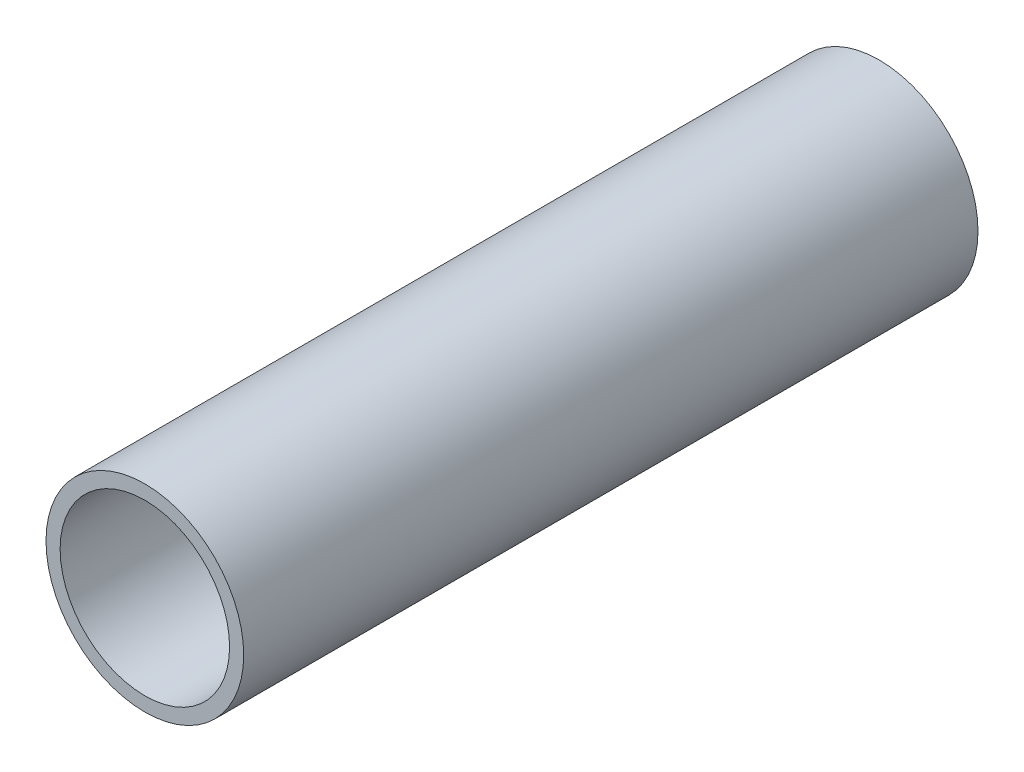
ISO-10303-21;
HEADER;
FILE_DESCRIPTION(('STEP AP214'),'2;1');
FILE_NAME('part.step','',(''),(''),'','','');
FILE_SCHEMA(('AUTOMOTIVE_DESIGN { 1 0 10303 214 1 1 1 1 }'));
ENDSEC;
DATA;
#1=APPLICATION_CONTEXT('core data for automotive mechanical design processes');
#2=APPLICATION_PROTOCOL_DEFINITION('international standard','automotive_design',2000,#1);
#3=PRODUCT_CONTEXT('',#1,'mechanical');
#4=PRODUCT('Part','Part','',(#3));
#5=PRODUCT_RELATED_PRODUCT_CATEGORY('part','',(#4));
#6=PRODUCT_DEFINITION_FORMATION('','',#4);
#7=PRODUCT_DEFINITION_CONTEXT('part definition',#1,'design');
#8=PRODUCT_DEFINITION('design','',#6,#7);
#9=PRODUCT_DEFINITION_SHAPE('','',#8);
#10=(LENGTH_UNIT() NAMED_UNIT(*) SI_UNIT(.MILLI.,.METRE.));
#11=(NAMED_UNIT(*) PLANE_ANGLE_UNIT() SI_UNIT($,.RADIAN.));
#12=(NAMED_UNIT(*) SI_UNIT($,.STERADIAN.) SOLID_ANGLE_UNIT());
#13=UNCERTAINTY_MEASURE_WITH_UNIT(LENGTH_MEASURE(1.E-05),#10,'distance_accuracy_value','');
#14=(GEOMETRIC_REPRESENTATION_CONTEXT(3) GLOBAL_UNCERTAINTY_ASSIGNED_CONTEXT((#13)) GLOBAL_UNIT_ASSIGNED_CONTEXT((#10,
#11,#12)) REPRESENTATION_CONTEXT('',''));
#15=CARTESIAN_POINT('',(0.,0.,0.));
#16=DIRECTION('',(0.,0.,1.));
#17=DIRECTION('',(1.,0.,0.));
#18=AXIS2_PLACEMENT_3D('',#15,#16,#17);
#19=CARTESIAN_POINT('',(0.,0.,41.275));
#20=DIRECTION('',(0.,0.,1.));
#21=DIRECTION('',(1.,0.,0.));
#22=AXIS2_PLACEMENT_3D('',#19,#20,#21);
#23=PLANE('',#22);
#24=CARTESIAN_POINT('',(0.,0.,41.275));
#25=DIRECTION('',(0.,0.,1.));
#26=DIRECTION('',(1.,0.,0.));
#27=AXIS2_PLACEMENT_3D('',#24,#25,#26);
#28=CIRCLE('',#27,11.1125);
#29=CARTESIAN_POINT('',(11.1125,0.,41.275));
#30=VERTEX_POINT('',#29);
#31=EDGE_CURVE('E10',#30,#30,#28,.T.);
#32=ORIENTED_EDGE('',*,*,#31,.T.);
#33=EDGE_LOOP('',(#32));
#34=FACE_BOUND('',#33,.T.);
#35=CARTESIAN_POINT('',(0.,0.,41.275));
#36=DIRECTION('',(0.,0.,1.));
#37=DIRECTION('',(1.,0.,0.));
#38=AXIS2_PLACEMENT_3D('',#35,#36,#37);
#39=CIRCLE('',#38,9.525);
#40=CARTESIAN_POINT('',(9.525,0.,41.275));
#41=VERTEX_POINT('',#40);
#42=EDGE_CURVE('E45',#41,#41,#39,.T.);
#43=ORIENTED_EDGE('',*,*,#42,.F.);
#44=EDGE_LOOP('',(#43));
#45=FACE_BOUND('',#44,.T.);
#46=ADVANCED_FACE('F34',(#34,#45),#23,.T.);
#47=CARTESIAN_POINT('',(0.,0.,-41.275));
#48=DIRECTION('',(0.,0.,1.));
#49=DIRECTION('',(1.,0.,0.));
#50=AXIS2_PLACEMENT_3D('',#47,#48,#49);
#51=PLANE('',#50);
#52=CARTESIAN_POINT('',(0.,0.,-41.275));
#53=DIRECTION('',(0.,0.,1.));
#54=DIRECTION('',(1.,0.,0.));
#55=AXIS2_PLACEMENT_3D('',#52,#53,#54);
#56=CIRCLE('',#55,11.1125);
#57=CARTESIAN_POINT('',(11.1125,0.,-41.275));
#58=VERTEX_POINT('',#57);
#59=EDGE_CURVE('E38',#58,#58,#56,.T.);
#60=ORIENTED_EDGE('',*,*,#59,.F.);
#61=EDGE_LOOP('',(#60));
#62=FACE_BOUND('',#61,.T.);
#63=CARTESIAN_POINT('',(0.,0.,-41.275));
#64=DIRECTION('',(0.,0.,1.));
#65=DIRECTION('',(1.,0.,0.));
#66=AXIS2_PLACEMENT_3D('',#63,#64,#65);
#67=CIRCLE('',#66,9.525);
#68=CARTESIAN_POINT('',(9.525,0.,-41.275));
#69=VERTEX_POINT('',#68);
#70=EDGE_CURVE('E47',#69,#69,#67,.T.);
#71=ORIENTED_EDGE('',*,*,#70,.T.);
#72=EDGE_LOOP('',(#71));
#73=FACE_BOUND('',#72,.T.);
#74=ADVANCED_FACE('F57',(#62,#73),#51,.F.);
#75=CARTESIAN_POINT('',(0.,0.,41.275));
#76=DIRECTION('',(0.,0.,-1.));
#77=DIRECTION('',(-1.,0.,0.));
#78=AXIS2_PLACEMENT_3D('',#75,#76,#77);
#79=CYLINDRICAL_SURFACE('',#78,11.1125);
#80=ORIENTED_EDGE('',*,*,#31,.F.);
#81=EDGE_LOOP('',(#80));
#82=FACE_BOUND('',#81,.T.);
#83=ORIENTED_EDGE('',*,*,#59,.T.);
#84=EDGE_LOOP('',(#83));
#85=FACE_BOUND('',#84,.T.);
#86=ADVANCED_FACE('F36',(#82,#85),#79,.T.);
#87=CARTESIAN_POINT('',(0.,0.,41.275));
#88=DIRECTION('',(0.,0.,-1.));
#89=DIRECTION('',(-1.,0.,0.));
#90=AXIS2_PLACEMENT_3D('',#87,#88,#89);
#91=CYLINDRICAL_SURFACE('',#90,9.525);
#92=ORIENTED_EDGE('',*,*,#42,.T.);
#93=EDGE_LOOP('',(#92));
#94=FACE_BOUND('',#93,.T.);
#95=ORIENTED_EDGE('',*,*,#70,.F.);
#96=EDGE_LOOP('',(#95));
#97=FACE_BOUND('',#96,.T.);
#98=ADVANCED_FACE('F53',(#94,#97),#91,.F.);
#99=CLOSED_SHELL('',(#46,#74,#86,#98));
#100=MANIFOLD_SOLID_BREP('B2',#99);
#101=ADVANCED_BREP_SHAPE_REPRESENTATION('',(#18,#100),#14);
#102=SHAPE_DEFINITION_REPRESENTATION(#9,#101);
ENDSEC;
END-ISO-10303-21;
